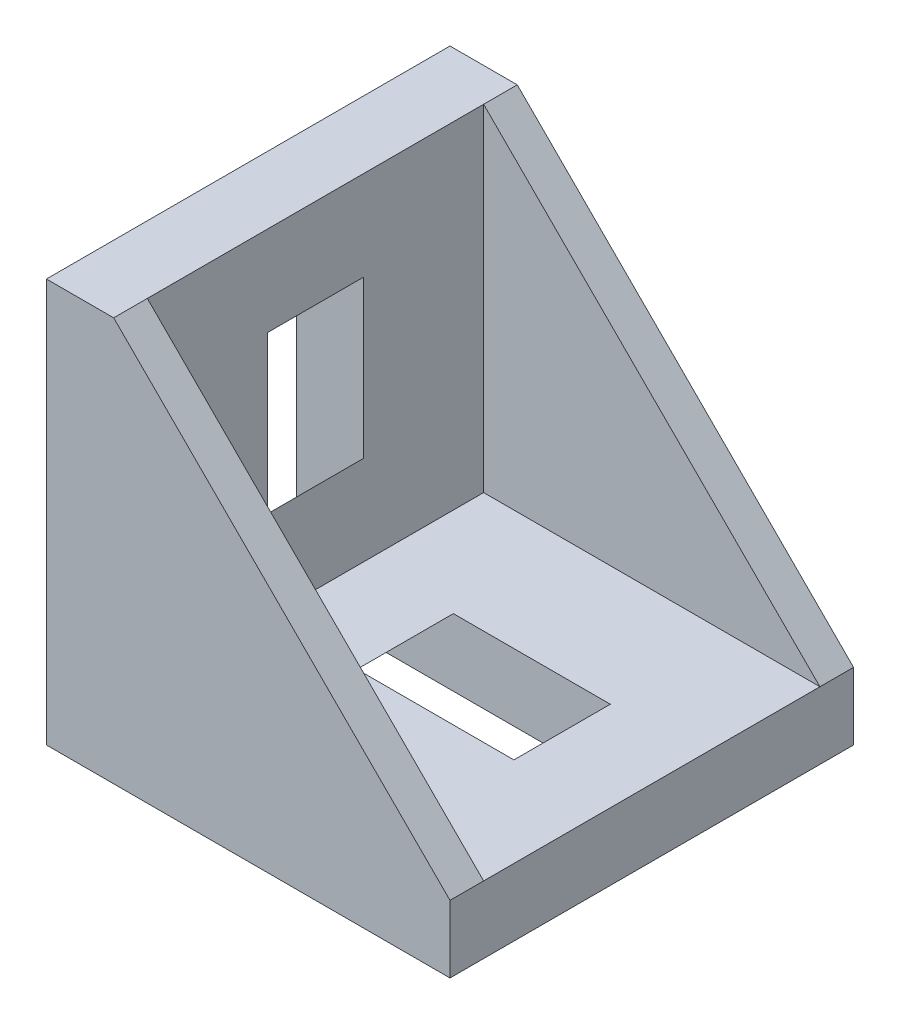
ISO-10303-21;
HEADER;
FILE_DESCRIPTION(('STEP AP214'),'2;1');
FILE_NAME('part.step','',(''),(''),'','','');
FILE_SCHEMA(('AUTOMOTIVE_DESIGN { 1 0 10303 214 1 1 1 1 }'));
ENDSEC;
DATA;
#1=APPLICATION_CONTEXT('core data for automotive mechanical design processes');
#2=APPLICATION_PROTOCOL_DEFINITION('international standard','automotive_design',2000,#1);
#3=PRODUCT_CONTEXT('',#1,'mechanical');
#4=PRODUCT('Part','Part','',(#3));
#5=PRODUCT_RELATED_PRODUCT_CATEGORY('part','',(#4));
#6=PRODUCT_DEFINITION_FORMATION('','',#4);
#7=PRODUCT_DEFINITION_CONTEXT('part definition',#1,'design');
#8=PRODUCT_DEFINITION('design','',#6,#7);
#9=PRODUCT_DEFINITION_SHAPE('','',#8);
#10=(LENGTH_UNIT() NAMED_UNIT(*) SI_UNIT(.MILLI.,.METRE.));
#11=(NAMED_UNIT(*) PLANE_ANGLE_UNIT() SI_UNIT($,.RADIAN.));
#12=(NAMED_UNIT(*) SI_UNIT($,.STERADIAN.) SOLID_ANGLE_UNIT());
#13=UNCERTAINTY_MEASURE_WITH_UNIT(LENGTH_MEASURE(1.E-05),#10,'distance_accuracy_value','');
#14=(GEOMETRIC_REPRESENTATION_CONTEXT(3) GLOBAL_UNCERTAINTY_ASSIGNED_CONTEXT((#13)) GLOBAL_UNIT_ASSIGNED_CONTEXT((#10,
#11,#12)) REPRESENTATION_CONTEXT('',''));
#15=CARTESIAN_POINT('',(0.,0.,0.));
#16=DIRECTION('',(0.,0.,1.));
#17=DIRECTION('',(1.,0.,0.));
#18=AXIS2_PLACEMENT_3D('',#15,#16,#17);
#19=CARTESIAN_POINT('',(18.,0.,9.));
#20=DIRECTION('',(0.,1.,0.));
#21=DIRECTION('',(-1.,0.,0.));
#22=AXIS2_PLACEMENT_3D('',#19,#20,#21);
#23=PLANE('',#22);
#24=DIRECTION('',(1.,0.,0.));
#25=VECTOR('',#24,1.);
#26=CARTESIAN_POINT('',(18.,0.,-9.));
#27=LINE('',#26,#25);
#28=CARTESIAN_POINT('',(0.,0.,-9.));
#29=VERTEX_POINT('',#28);
#30=CARTESIAN_POINT('',(18.,0.,-9.));
#31=VERTEX_POINT('',#30);
#32=EDGE_CURVE('E275',#29,#31,#27,.T.);
#33=ORIENTED_EDGE('',*,*,#32,.T.);
#34=DIRECTION('',(0.,0.,-1.));
#35=VECTOR('',#34,1.);
#36=CARTESIAN_POINT('',(18.,0.,9.));
#37=LINE('',#36,#35);
#38=CARTESIAN_POINT('',(18.,0.,9.));
#39=VERTEX_POINT('',#38);
#40=EDGE_CURVE('E11',#39,#31,#37,.T.);
#41=ORIENTED_EDGE('',*,*,#40,.F.);
#42=DIRECTION('',(1.,0.,0.));
#43=VECTOR('',#42,1.);
#44=CARTESIAN_POINT('',(18.,0.,9.));
#45=LINE('',#44,#43);
#46=CARTESIAN_POINT('',(0.,0.,9.));
#47=VERTEX_POINT('',#46);
#48=EDGE_CURVE('E281',#47,#39,#45,.T.);
#49=ORIENTED_EDGE('',*,*,#48,.F.);
#50=DIRECTION('',(0.,0.,-1.));
#51=VECTOR('',#50,1.);
#52=CARTESIAN_POINT('',(0.,0.,9.));
#53=LINE('',#52,#51);
#54=EDGE_CURVE('E298',#47,#29,#53,.T.);
#55=ORIENTED_EDGE('',*,*,#54,.T.);
#56=EDGE_LOOP('',(#33,#41,#49,#55));
#57=FACE_BOUND('',#56,.T.);
#58=DIRECTION('',(1.,0.,0.));
#59=VECTOR('',#58,1.);
#60=CARTESIAN_POINT('',(4.,0.,-2.15));
#61=LINE('',#60,#59);
#62=CARTESIAN_POINT('',(4.,0.,-2.15));
#63=VERTEX_POINT('',#62);
#64=CARTESIAN_POINT('',(14.,0.,-2.15));
#65=VERTEX_POINT('',#64);
#66=EDGE_CURVE('E166',#63,#65,#61,.T.);
#67=ORIENTED_EDGE('',*,*,#66,.F.);
#68=DIRECTION('',(0.,0.,1.));
#69=VECTOR('',#68,1.);
#70=CARTESIAN_POINT('',(4.,0.,-2.15));
#71=LINE('',#70,#69);
#72=CARTESIAN_POINT('',(4.,0.,2.15));
#73=VERTEX_POINT('',#72);
#74=EDGE_CURVE('E150',#63,#73,#71,.T.);
#75=ORIENTED_EDGE('',*,*,#74,.T.);
#76=DIRECTION('',(1.,0.,0.));
#77=VECTOR('',#76,1.);
#78=CARTESIAN_POINT('',(4.,0.,2.15));
#79=LINE('',#78,#77);
#80=CARTESIAN_POINT('',(14.,0.,2.15));
#81=VERTEX_POINT('',#80);
#82=EDGE_CURVE('E183',#73,#81,#79,.T.);
#83=ORIENTED_EDGE('',*,*,#82,.T.);
#84=DIRECTION('',(0.,0.,1.));
#85=VECTOR('',#84,1.);
#86=CARTESIAN_POINT('',(14.,0.,-2.15));
#87=LINE('',#86,#85);
#88=EDGE_CURVE('E159',#65,#81,#87,.T.);
#89=ORIENTED_EDGE('',*,*,#88,.F.);
#90=EDGE_LOOP('',(#67,#75,#83,#89));
#91=FACE_BOUND('',#90,.T.);
#92=ADVANCED_FACE('F39',(#57,#91),#23,.F.);
#93=CARTESIAN_POINT('',(3.,3.,-7.5));
#94=DIRECTION('',(0.,-1.,0.));
#95=DIRECTION('',(0.,0.,-1.));
#96=AXIS2_PLACEMENT_3D('',#93,#94,#95);
#97=PLANE('',#96);
#98=DIRECTION('',(1.,0.,0.));
#99=VECTOR('',#98,1.);
#100=CARTESIAN_POINT('',(3.,3.,7.5));
#101=LINE('',#100,#99);
#102=CARTESIAN_POINT('',(3.,3.,7.5));
#103=VERTEX_POINT('',#102);
#104=CARTESIAN_POINT('',(18.,3.,7.5));
#105=VERTEX_POINT('',#104);
#106=EDGE_CURVE('E252',#103,#105,#101,.T.);
#107=ORIENTED_EDGE('',*,*,#106,.T.);
#108=DIRECTION('',(0.,0.,1.));
#109=VECTOR('',#108,1.);
#110=CARTESIAN_POINT('',(18.,3.,-7.5));
#111=LINE('',#110,#109);
#112=CARTESIAN_POINT('',(18.,3.,-7.5));
#113=VERTEX_POINT('',#112);
#114=EDGE_CURVE('E271',#113,#105,#111,.T.);
#115=ORIENTED_EDGE('',*,*,#114,.F.);
#116=DIRECTION('',(1.,0.,0.));
#117=VECTOR('',#116,1.);
#118=CARTESIAN_POINT('',(3.,3.,-7.5));
#119=LINE('',#118,#117);
#120=CARTESIAN_POINT('',(3.,3.,-7.5));
#121=VERTEX_POINT('',#120);
#122=EDGE_CURVE('E256',#121,#113,#119,.T.);
#123=ORIENTED_EDGE('',*,*,#122,.F.);
#124=DIRECTION('',(0.,0.,1.));
#125=VECTOR('',#124,1.);
#126=CARTESIAN_POINT('',(3.,3.,-7.5));
#127=LINE('',#126,#125);
#128=EDGE_CURVE('E276',#121,#103,#127,.T.);
#129=ORIENTED_EDGE('',*,*,#128,.T.);
#130=EDGE_LOOP('',(#107,#115,#123,#129));
#131=FACE_BOUND('',#130,.T.);
#132=DIRECTION('',(-1.,0.,0.));
#133=VECTOR('',#132,1.);
#134=CARTESIAN_POINT('',(7.,3.,-2.15));
#135=LINE('',#134,#133);
#136=CARTESIAN_POINT('',(14.,3.,-2.15));
#137=VERTEX_POINT('',#136);
#138=CARTESIAN_POINT('',(7.,3.,-2.15));
#139=VERTEX_POINT('',#138);
#140=EDGE_CURVE('E160',#137,#139,#135,.T.);
#141=ORIENTED_EDGE('',*,*,#140,.F.);
#142=DIRECTION('',(0.,0.,1.));
#143=VECTOR('',#142,1.);
#144=CARTESIAN_POINT('',(14.,3.,-2.15));
#145=LINE('',#144,#143);
#146=CARTESIAN_POINT('',(14.,3.,2.15));
#147=VERTEX_POINT('',#146);
#148=EDGE_CURVE('E195',#137,#147,#145,.T.);
#149=ORIENTED_EDGE('',*,*,#148,.T.);
#150=DIRECTION('',(-1.,0.,0.));
#151=VECTOR('',#150,1.);
#152=CARTESIAN_POINT('',(7.,3.,2.15));
#153=LINE('',#152,#151);
#154=CARTESIAN_POINT('',(7.,3.,2.15));
#155=VERTEX_POINT('',#154);
#156=EDGE_CURVE('E171',#147,#155,#153,.T.);
#157=ORIENTED_EDGE('',*,*,#156,.T.);
#158=DIRECTION('',(0.,0.,1.));
#159=VECTOR('',#158,1.);
#160=CARTESIAN_POINT('',(7.,3.,-2.15));
#161=LINE('',#160,#159);
#162=EDGE_CURVE('E191',#139,#155,#161,.T.);
#163=ORIENTED_EDGE('',*,*,#162,.F.);
#164=EDGE_LOOP('',(#141,#149,#157,#163));
#165=FACE_BOUND('',#164,.T.);
#166=ADVANCED_FACE('F367',(#131,#165),#97,.F.);
#167=CARTESIAN_POINT('',(0.,0.,9.));
#168=DIRECTION('',(1.,0.,0.));
#169=DIRECTION('',(0.,0.,-1.));
#170=AXIS2_PLACEMENT_3D('',#167,#168,#169);
#171=PLANE('',#170);
#172=DIRECTION('',(0.,-1.,0.));
#173=VECTOR('',#172,1.);
#174=CARTESIAN_POINT('',(0.,0.,-9.));
#175=LINE('',#174,#173);
#176=CARTESIAN_POINT('',(0.,18.,-9.));
#177=VERTEX_POINT('',#176);
#178=EDGE_CURVE('E286',#177,#29,#175,.T.);
#179=ORIENTED_EDGE('',*,*,#178,.T.);
#180=ORIENTED_EDGE('',*,*,#54,.F.);
#181=DIRECTION('',(0.,-1.,0.));
#182=VECTOR('',#181,1.);
#183=CARTESIAN_POINT('',(0.,0.,9.));
#184=LINE('',#183,#182);
#185=CARTESIAN_POINT('',(0.,18.,9.));
#186=VERTEX_POINT('',#185);
#187=EDGE_CURVE('E295',#186,#47,#184,.T.);
#188=ORIENTED_EDGE('',*,*,#187,.F.);
#189=DIRECTION('',(0.,0.,-1.));
#190=VECTOR('',#189,1.);
#191=CARTESIAN_POINT('',(0.,18.,9.));
#192=LINE('',#191,#190);
#193=EDGE_CURVE('E318',#186,#177,#192,.T.);
#194=ORIENTED_EDGE('',*,*,#193,.T.);
#195=EDGE_LOOP('',(#179,#180,#188,#194));
#196=FACE_BOUND('',#195,.T.);
#197=DIRECTION('',(0.,-1.,0.));
#198=VECTOR('',#197,1.);
#199=CARTESIAN_POINT('',(0.,14.,-2.15));
#200=LINE('',#199,#198);
#201=CARTESIAN_POINT('',(0.,14.,-2.15));
#202=VERTEX_POINT('',#201);
#203=CARTESIAN_POINT('',(0.,4.,-2.15));
#204=VERTEX_POINT('',#203);
#205=EDGE_CURVE('E201',#202,#204,#200,.T.);
#206=ORIENTED_EDGE('',*,*,#205,.F.);
#207=DIRECTION('',(0.,0.,1.));
#208=VECTOR('',#207,1.);
#209=CARTESIAN_POINT('',(0.,14.,-2.15));
#210=LINE('',#209,#208);
#211=CARTESIAN_POINT('',(0.,14.,2.15));
#212=VERTEX_POINT('',#211);
#213=EDGE_CURVE('E232',#202,#212,#210,.T.);
#214=ORIENTED_EDGE('',*,*,#213,.T.);
#215=DIRECTION('',(0.,-1.,0.));
#216=VECTOR('',#215,1.);
#217=CARTESIAN_POINT('',(0.,14.,2.15));
#218=LINE('',#217,#216);
#219=CARTESIAN_POINT('',(0.,4.,2.15));
#220=VERTEX_POINT('',#219);
#221=EDGE_CURVE('E194',#212,#220,#218,.T.);
#222=ORIENTED_EDGE('',*,*,#221,.T.);
#223=DIRECTION('',(0.,0.,1.));
#224=VECTOR('',#223,1.);
#225=CARTESIAN_POINT('',(0.,4.,-2.15));
#226=LINE('',#225,#224);
#227=EDGE_CURVE('E217',#204,#220,#226,.T.);
#228=ORIENTED_EDGE('',*,*,#227,.F.);
#229=EDGE_LOOP('',(#206,#214,#222,#228));
#230=FACE_BOUND('',#229,.T.);
#231=ADVANCED_FACE('F354',(#196,#230),#171,.F.);
#232=CARTESIAN_POINT('',(3.,18.,-7.5));
#233=DIRECTION('',(-1.,0.,0.));
#234=DIRECTION('',(0.,-1.,0.));
#235=AXIS2_PLACEMENT_3D('',#232,#233,#234);
#236=PLANE('',#235);
#237=DIRECTION('',(0.,-1.,0.));
#238=VECTOR('',#237,1.);
#239=CARTESIAN_POINT('',(3.,18.,7.5));
#240=LINE('',#239,#238);
#241=CARTESIAN_POINT('',(3.,18.,7.5));
#242=VERTEX_POINT('',#241);
#243=EDGE_CURVE('E264',#242,#103,#240,.T.);
#244=ORIENTED_EDGE('',*,*,#243,.T.);
#245=ORIENTED_EDGE('',*,*,#128,.F.);
#246=DIRECTION('',(0.,-1.,0.));
#247=VECTOR('',#246,1.);
#248=CARTESIAN_POINT('',(3.,18.,-7.5));
#249=LINE('',#248,#247);
#250=CARTESIAN_POINT('',(3.,18.,-7.5));
#251=VERTEX_POINT('',#250);
#252=EDGE_CURVE('E251',#251,#121,#249,.T.);
#253=ORIENTED_EDGE('',*,*,#252,.F.);
#254=DIRECTION('',(0.,0.,1.));
#255=VECTOR('',#254,1.);
#256=CARTESIAN_POINT('',(3.,18.,-7.5));
#257=LINE('',#256,#255);
#258=EDGE_CURVE('E260',#251,#242,#257,.T.);
#259=ORIENTED_EDGE('',*,*,#258,.T.);
#260=EDGE_LOOP('',(#244,#245,#253,#259));
#261=FACE_BOUND('',#260,.T.);
#262=DIRECTION('',(0.,1.,0.));
#263=VECTOR('',#262,1.);
#264=CARTESIAN_POINT('',(3.,14.,-2.15));
#265=LINE('',#264,#263);
#266=CARTESIAN_POINT('',(3.,7.,-2.15));
#267=VERTEX_POINT('',#266);
#268=CARTESIAN_POINT('',(3.,14.,-2.15));
#269=VERTEX_POINT('',#268);
#270=EDGE_CURVE('E210',#267,#269,#265,.T.);
#271=ORIENTED_EDGE('',*,*,#270,.F.);
#272=DIRECTION('',(0.,0.,1.));
#273=VECTOR('',#272,1.);
#274=CARTESIAN_POINT('',(3.,7.,-2.15));
#275=LINE('',#274,#273);
#276=CARTESIAN_POINT('',(3.,7.,2.15));
#277=VERTEX_POINT('',#276);
#278=EDGE_CURVE('E241',#267,#277,#275,.T.);
#279=ORIENTED_EDGE('',*,*,#278,.T.);
#280=DIRECTION('',(0.,1.,0.));
#281=VECTOR('',#280,1.);
#282=CARTESIAN_POINT('',(3.,14.,2.15));
#283=LINE('',#282,#281);
#284=CARTESIAN_POINT('',(3.,14.,2.15));
#285=VERTEX_POINT('',#284);
#286=EDGE_CURVE('E225',#277,#285,#283,.T.);
#287=ORIENTED_EDGE('',*,*,#286,.T.);
#288=DIRECTION('',(0.,0.,1.));
#289=VECTOR('',#288,1.);
#290=CARTESIAN_POINT('',(3.,14.,-2.15));
#291=LINE('',#290,#289);
#292=EDGE_CURVE('E237',#269,#285,#291,.T.);
#293=ORIENTED_EDGE('',*,*,#292,.F.);
#294=EDGE_LOOP('',(#271,#279,#287,#293));
#295=FACE_BOUND('',#294,.T.);
#296=ADVANCED_FACE('F372',(#261,#295),#236,.F.);
#297=CARTESIAN_POINT('',(18.,3.,9.));
#298=DIRECTION('',(-0.707106781186547,-0.707106781186547,0.));
#299=DIRECTION('',(0.707106781186548,-0.707106781186548,0.));
#300=AXIS2_PLACEMENT_3D('',#297,#298,#299);
#301=PLANE('',#300);
#302=DIRECTION('',(-0.707106781186547,0.707106781186547,0.));
#303=VECTOR('',#302,1.);
#304=CARTESIAN_POINT('',(3.,18.,-7.5));
#305=LINE('',#304,#303);
#306=EDGE_CURVE('E248',#113,#251,#305,.T.);
#307=ORIENTED_EDGE('',*,*,#306,.F.);
#308=DIRECTION('',(0.,0.,-1.));
#309=VECTOR('',#308,1.);
#310=CARTESIAN_POINT('',(18.,3.,9.));
#311=LINE('',#310,#309);
#312=CARTESIAN_POINT('',(18.,3.,-9.));
#313=VERTEX_POINT('',#312);
#314=EDGE_CURVE('E326',#113,#313,#311,.T.);
#315=ORIENTED_EDGE('',*,*,#314,.T.);
#316=DIRECTION('',(-0.707106781186547,0.707106781186547,0.));
#317=VECTOR('',#316,1.);
#318=CARTESIAN_POINT('',(18.,3.,-9.));
#319=LINE('',#318,#317);
#320=CARTESIAN_POINT('',(3.,18.,-9.));
#321=VERTEX_POINT('',#320);
#322=EDGE_CURVE('E306',#313,#321,#319,.T.);
#323=ORIENTED_EDGE('',*,*,#322,.T.);
#324=DIRECTION('',(0.,0.,-1.));
#325=VECTOR('',#324,1.);
#326=CARTESIAN_POINT('',(3.,18.,9.));
#327=LINE('',#326,#325);
#328=EDGE_CURVE('E322',#251,#321,#327,.T.);
#329=ORIENTED_EDGE('',*,*,#328,.F.);
#330=EDGE_LOOP('',(#307,#315,#323,#329));
#331=FACE_BOUND('',#330,.T.);
#332=ADVANCED_FACE('F336',(#331),#301,.F.);
#333=CARTESIAN_POINT('',(18.,3.,9.));
#334=DIRECTION('',(-1.,0.,0.));
#335=DIRECTION('',(0.,0.,1.));
#336=AXIS2_PLACEMENT_3D('',#333,#334,#335);
#337=PLANE('',#336);
#338=DIRECTION('',(0.,1.,0.));
#339=VECTOR('',#338,1.);
#340=CARTESIAN_POINT('',(18.,3.,-9.));
#341=LINE('',#340,#339);
#342=EDGE_CURVE('E302',#31,#313,#341,.T.);
#343=ORIENTED_EDGE('',*,*,#342,.T.);
#344=ORIENTED_EDGE('',*,*,#314,.F.);
#345=ORIENTED_EDGE('',*,*,#114,.T.);
#346=CARTESIAN_POINT('',(18.,3.,9.));
#347=VERTEX_POINT('',#346);
#348=EDGE_CURVE('E47',#347,#105,#311,.T.);
#349=ORIENTED_EDGE('',*,*,#348,.F.);
#350=DIRECTION('',(0.,1.,0.));
#351=VECTOR('',#350,1.);
#352=CARTESIAN_POINT('',(18.,3.,9.));
#353=LINE('',#352,#351);
#354=EDGE_CURVE('E285',#39,#347,#353,.T.);
#355=ORIENTED_EDGE('',*,*,#354,.F.);
#356=ORIENTED_EDGE('',*,*,#40,.T.);
#357=EDGE_LOOP('',(#343,#344,#345,#349,#355,#356));
#358=FACE_BOUND('',#357,.T.);
#359=ADVANCED_FACE('F341',(#358),#337,.F.);
#360=ORIENTED_EDGE('',*,*,#348,.T.);
#361=DIRECTION('',(-0.707106781186547,0.707106781186547,0.));
#362=VECTOR('',#361,1.);
#363=CARTESIAN_POINT('',(3.,18.,7.5));
#364=LINE('',#363,#362);
#365=EDGE_CURVE('E236',#105,#242,#364,.T.);
#366=ORIENTED_EDGE('',*,*,#365,.T.);
#367=CARTESIAN_POINT('',(3.,18.,9.));
#368=VERTEX_POINT('',#367);
#369=EDGE_CURVE('E323',#368,#242,#327,.T.);
#370=ORIENTED_EDGE('',*,*,#369,.F.);
#371=DIRECTION('',(-0.707106781186547,0.707106781186547,0.));
#372=VECTOR('',#371,1.);
#373=CARTESIAN_POINT('',(18.,3.,9.));
#374=LINE('',#373,#372);
#375=EDGE_CURVE('E289',#347,#368,#374,.T.);
#376=ORIENTED_EDGE('',*,*,#375,.F.);
#377=EDGE_LOOP('',(#360,#366,#370,#376));
#378=FACE_BOUND('',#377,.T.);
#379=ADVANCED_FACE('F361',(#378),#301,.F.);
#380=CARTESIAN_POINT('',(3.,18.,9.));
#381=DIRECTION('',(0.,-1.,0.));
#382=DIRECTION('',(0.,0.,-1.));
#383=AXIS2_PLACEMENT_3D('',#380,#381,#382);
#384=PLANE('',#383);
#385=DIRECTION('',(-1.,0.,0.));
#386=VECTOR('',#385,1.);
#387=CARTESIAN_POINT('',(3.,18.,-9.));
#388=LINE('',#387,#386);
#389=EDGE_CURVE('E310',#321,#177,#388,.T.);
#390=ORIENTED_EDGE('',*,*,#389,.T.);
#391=ORIENTED_EDGE('',*,*,#193,.F.);
#392=DIRECTION('',(-1.,0.,0.));
#393=VECTOR('',#392,1.);
#394=CARTESIAN_POINT('',(3.,18.,9.));
#395=LINE('',#394,#393);
#396=EDGE_CURVE('E292',#368,#186,#395,.T.);
#397=ORIENTED_EDGE('',*,*,#396,.F.);
#398=ORIENTED_EDGE('',*,*,#369,.T.);
#399=ORIENTED_EDGE('',*,*,#258,.F.);
#400=ORIENTED_EDGE('',*,*,#328,.T.);
#401=EDGE_LOOP('',(#390,#391,#397,#398,#399,#400));
#402=FACE_BOUND('',#401,.T.);
#403=ADVANCED_FACE('F349',(#402),#384,.F.);
#404=CARTESIAN_POINT('',(0.,0.,9.));
#405=DIRECTION('',(0.,0.,-1.));
#406=DIRECTION('',(-1.,0.,0.));
#407=AXIS2_PLACEMENT_3D('',#404,#405,#406);
#408=PLANE('',#407);
#409=ORIENTED_EDGE('',*,*,#48,.T.);
#410=ORIENTED_EDGE('',*,*,#354,.T.);
#411=ORIENTED_EDGE('',*,*,#375,.T.);
#412=ORIENTED_EDGE('',*,*,#396,.T.);
#413=ORIENTED_EDGE('',*,*,#187,.T.);
#414=EDGE_LOOP('',(#409,#410,#411,#412,#413));
#415=FACE_BOUND('',#414,.T.);
#416=ADVANCED_FACE('F359',(#415),#408,.F.);
#417=CARTESIAN_POINT('',(0.,0.,-9.));
#418=DIRECTION('',(0.,0.,-1.));
#419=DIRECTION('',(-1.,0.,0.));
#420=AXIS2_PLACEMENT_3D('',#417,#418,#419);
#421=PLANE('',#420);
#422=ORIENTED_EDGE('',*,*,#32,.F.);
#423=ORIENTED_EDGE('',*,*,#178,.F.);
#424=ORIENTED_EDGE('',*,*,#389,.F.);
#425=ORIENTED_EDGE('',*,*,#322,.F.);
#426=ORIENTED_EDGE('',*,*,#342,.F.);
#427=EDGE_LOOP('',(#422,#423,#424,#425,#426));
#428=FACE_BOUND('',#427,.T.);
#429=ADVANCED_FACE('F345',(#428),#421,.T.);
#430=CARTESIAN_POINT('',(18.,3.,-7.5));
#431=DIRECTION('',(0.,0.,1.));
#432=DIRECTION('',(1.,0.,0.));
#433=AXIS2_PLACEMENT_3D('',#430,#431,#432);
#434=PLANE('',#433);
#435=ORIENTED_EDGE('',*,*,#306,.T.);
#436=ORIENTED_EDGE('',*,*,#252,.T.);
#437=ORIENTED_EDGE('',*,*,#122,.T.);
#438=EDGE_LOOP('',(#435,#436,#437));
#439=FACE_BOUND('',#438,.T.);
#440=ADVANCED_FACE('F376',(#439),#434,.T.);
#441=CARTESIAN_POINT('',(18.,3.,7.5));
#442=DIRECTION('',(0.,0.,1.));
#443=DIRECTION('',(1.,0.,0.));
#444=AXIS2_PLACEMENT_3D('',#441,#442,#443);
#445=PLANE('',#444);
#446=ORIENTED_EDGE('',*,*,#365,.F.);
#447=ORIENTED_EDGE('',*,*,#106,.F.);
#448=ORIENTED_EDGE('',*,*,#243,.F.);
#449=EDGE_LOOP('',(#446,#447,#448));
#450=FACE_BOUND('',#449,.T.);
#451=ADVANCED_FACE('F365',(#450),#445,.F.);
#452=CARTESIAN_POINT('',(0.,14.,-2.15));
#453=DIRECTION('',(0.,1.,0.));
#454=DIRECTION('',(0.,0.,1.));
#455=AXIS2_PLACEMENT_3D('',#452,#453,#454);
#456=PLANE('',#455);
#457=DIRECTION('',(-1.,0.,0.));
#458=VECTOR('',#457,1.);
#459=CARTESIAN_POINT('',(0.,14.,2.15));
#460=LINE('',#459,#458);
#461=EDGE_CURVE('E206',#285,#212,#460,.T.);
#462=ORIENTED_EDGE('',*,*,#461,.T.);
#463=ORIENTED_EDGE('',*,*,#213,.F.);
#464=DIRECTION('',(-1.,0.,0.));
#465=VECTOR('',#464,1.);
#466=CARTESIAN_POINT('',(0.,14.,-2.15));
#467=LINE('',#466,#465);
#468=EDGE_CURVE('E213',#269,#202,#467,.T.);
#469=ORIENTED_EDGE('',*,*,#468,.F.);
#470=ORIENTED_EDGE('',*,*,#292,.T.);
#471=EDGE_LOOP('',(#462,#463,#469,#470));
#472=FACE_BOUND('',#471,.T.);
#473=ADVANCED_FACE('F383',(#472),#456,.F.);
#474=CARTESIAN_POINT('',(0.,4.,-2.15));
#475=DIRECTION('',(0.707106781186548,-0.707106781186547,0.));
#476=DIRECTION('',(0.707106781186547,0.707106781186548,0.));
#477=AXIS2_PLACEMENT_3D('',#474,#475,#476);
#478=PLANE('',#477);
#479=DIRECTION('',(0.707106781186547,0.707106781186548,0.));
#480=VECTOR('',#479,1.);
#481=CARTESIAN_POINT('',(0.,4.,2.15));
#482=LINE('',#481,#480);
#483=EDGE_CURVE('E221',#220,#277,#482,.T.);
#484=ORIENTED_EDGE('',*,*,#483,.T.);
#485=ORIENTED_EDGE('',*,*,#278,.F.);
#486=DIRECTION('',(0.707106781186547,0.707106781186548,0.));
#487=VECTOR('',#486,1.);
#488=CARTESIAN_POINT('',(0.,4.,-2.15));
#489=LINE('',#488,#487);
#490=EDGE_CURVE('E205',#204,#267,#489,.T.);
#491=ORIENTED_EDGE('',*,*,#490,.F.);
#492=ORIENTED_EDGE('',*,*,#227,.T.);
#493=EDGE_LOOP('',(#484,#485,#491,#492));
#494=FACE_BOUND('',#493,.T.);
#495=ADVANCED_FACE('F476',(#494),#478,.F.);
#496=CARTESIAN_POINT('',(0.,14.,-2.15));
#497=DIRECTION('',(0.,0.,1.));
#498=DIRECTION('',(1.,0.,0.));
#499=AXIS2_PLACEMENT_3D('',#496,#497,#498);
#500=PLANE('',#499);
#501=ORIENTED_EDGE('',*,*,#205,.T.);
#502=ORIENTED_EDGE('',*,*,#490,.T.);
#503=ORIENTED_EDGE('',*,*,#270,.T.);
#504=ORIENTED_EDGE('',*,*,#468,.T.);
#505=EDGE_LOOP('',(#501,#502,#503,#504));
#506=FACE_BOUND('',#505,.T.);
#507=ADVANCED_FACE('F483',(#506),#500,.T.);
#508=CARTESIAN_POINT('',(0.,14.,2.15));
#509=DIRECTION('',(0.,0.,1.));
#510=DIRECTION('',(1.,0.,0.));
#511=AXIS2_PLACEMENT_3D('',#508,#509,#510);
#512=PLANE('',#511);
#513=ORIENTED_EDGE('',*,*,#221,.F.);
#514=ORIENTED_EDGE('',*,*,#461,.F.);
#515=ORIENTED_EDGE('',*,*,#286,.F.);
#516=ORIENTED_EDGE('',*,*,#483,.F.);
#517=EDGE_LOOP('',(#513,#514,#515,#516));
#518=FACE_BOUND('',#517,.T.);
#519=ADVANCED_FACE('F490',(#518),#512,.F.);
#520=CARTESIAN_POINT('',(7.,3.,-2.15));
#521=DIRECTION('',(-0.707106781186548,0.707106781186547,0.));
#522=DIRECTION('',(-0.707106781186547,-0.707106781186548,0.));
#523=AXIS2_PLACEMENT_3D('',#520,#521,#522);
#524=PLANE('',#523);
#525=DIRECTION('',(-0.707106781186547,-0.707106781186548,0.));
#526=VECTOR('',#525,1.);
#527=CARTESIAN_POINT('',(7.,3.,2.15));
#528=LINE('',#527,#526);
#529=EDGE_CURVE('E59',#155,#73,#528,.T.);
#530=ORIENTED_EDGE('',*,*,#529,.T.);
#531=ORIENTED_EDGE('',*,*,#74,.F.);
#532=DIRECTION('',(-0.707106781186547,-0.707106781186548,0.));
#533=VECTOR('',#532,1.);
#534=CARTESIAN_POINT('',(7.,3.,-2.15));
#535=LINE('',#534,#533);
#536=EDGE_CURVE('E153',#139,#63,#535,.T.);
#537=ORIENTED_EDGE('',*,*,#536,.F.);
#538=ORIENTED_EDGE('',*,*,#162,.T.);
#539=EDGE_LOOP('',(#530,#531,#537,#538));
#540=FACE_BOUND('',#539,.T.);
#541=ADVANCED_FACE('F152',(#540),#524,.F.);
#542=CARTESIAN_POINT('',(14.,3.,-2.15));
#543=DIRECTION('',(1.,0.,0.));
#544=DIRECTION('',(0.,0.,-1.));
#545=AXIS2_PLACEMENT_3D('',#542,#543,#544);
#546=PLANE('',#545);
#547=DIRECTION('',(0.,1.,0.));
#548=VECTOR('',#547,1.);
#549=CARTESIAN_POINT('',(14.,3.,2.15));
#550=LINE('',#549,#548);
#551=EDGE_CURVE('E54',#81,#147,#550,.T.);
#552=ORIENTED_EDGE('',*,*,#551,.T.);
#553=ORIENTED_EDGE('',*,*,#148,.F.);
#554=DIRECTION('',(0.,1.,0.));
#555=VECTOR('',#554,1.);
#556=CARTESIAN_POINT('',(14.,3.,-2.15));
#557=LINE('',#556,#555);
#558=EDGE_CURVE('E174',#65,#137,#557,.T.);
#559=ORIENTED_EDGE('',*,*,#558,.F.);
#560=ORIENTED_EDGE('',*,*,#88,.T.);
#561=EDGE_LOOP('',(#552,#553,#559,#560));
#562=FACE_BOUND('',#561,.T.);
#563=ADVANCED_FACE('F505',(#562),#546,.F.);
#564=CARTESIAN_POINT('',(4.,0.,-2.15));
#565=DIRECTION('',(0.,0.,1.));
#566=DIRECTION('',(1.,0.,0.));
#567=AXIS2_PLACEMENT_3D('',#564,#565,#566);
#568=PLANE('',#567);
#569=ORIENTED_EDGE('',*,*,#536,.T.);
#570=ORIENTED_EDGE('',*,*,#66,.T.);
#571=ORIENTED_EDGE('',*,*,#558,.T.);
#572=ORIENTED_EDGE('',*,*,#140,.T.);
#573=EDGE_LOOP('',(#569,#570,#571,#572));
#574=FACE_BOUND('',#573,.T.);
#575=ADVANCED_FACE('F164',(#574),#568,.T.);
#576=CARTESIAN_POINT('',(4.,0.,2.15));
#577=DIRECTION('',(0.,0.,1.));
#578=DIRECTION('',(1.,0.,0.));
#579=AXIS2_PLACEMENT_3D('',#576,#577,#578);
#580=PLANE('',#579);
#581=ORIENTED_EDGE('',*,*,#529,.F.);
#582=ORIENTED_EDGE('',*,*,#156,.F.);
#583=ORIENTED_EDGE('',*,*,#551,.F.);
#584=ORIENTED_EDGE('',*,*,#82,.F.);
#585=EDGE_LOOP('',(#581,#582,#583,#584));
#586=FACE_BOUND('',#585,.T.);
#587=ADVANCED_FACE('F519',(#586),#580,.F.);
#588=CLOSED_SHELL('',(#92,#166,#231,#296,#332,#359,#379,#403,#416,#429,#440,#451,#473,#495,#507,
#519,#541,#563,#575,#587));
#589=MANIFOLD_SOLID_BREP('B2',#588);
#590=ADVANCED_BREP_SHAPE_REPRESENTATION('',(#18,#589),#14);
#591=SHAPE_DEFINITION_REPRESENTATION(#9,#590);
ENDSEC;
END-ISO-10303-21;
